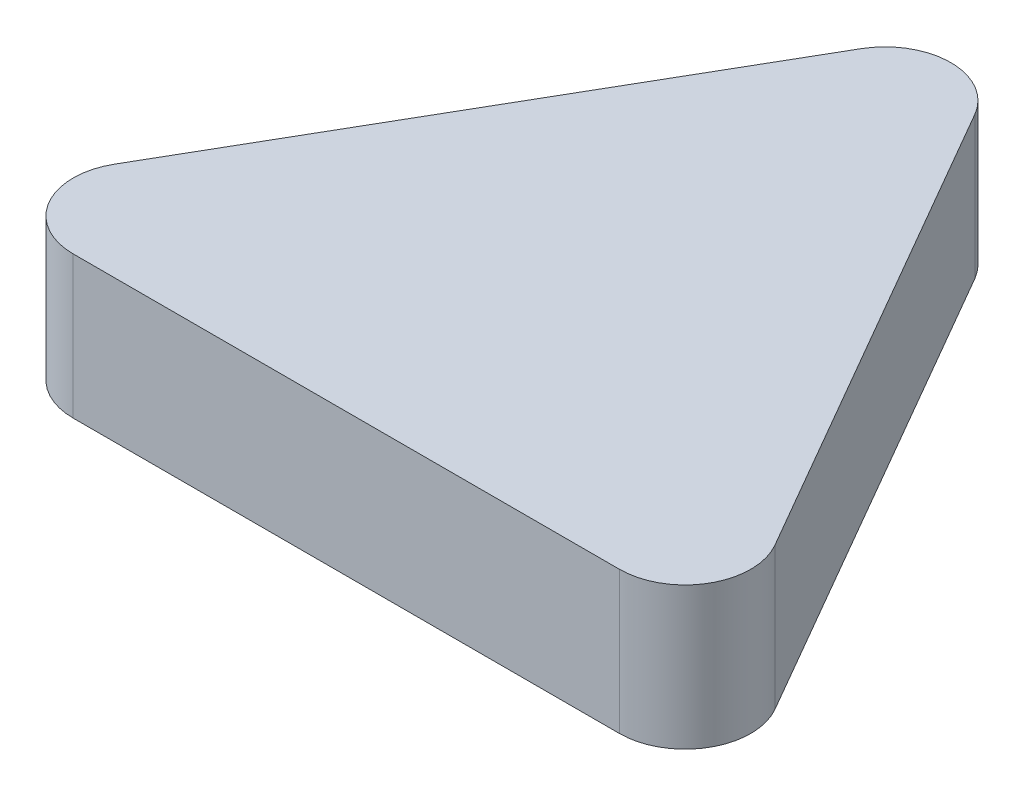
ISO-10303-21;
HEADER;
FILE_DESCRIPTION(('STEP AP214'),'2;1');
FILE_NAME('part.step','',(''),(''),'','','');
FILE_SCHEMA(('AUTOMOTIVE_DESIGN { 1 0 10303 214 1 1 1 1 }'));
ENDSEC;
DATA;
#1=APPLICATION_CONTEXT('core data for automotive mechanical design processes');
#2=APPLICATION_PROTOCOL_DEFINITION('international standard','automotive_design',2000,#1);
#3=PRODUCT_CONTEXT('',#1,'mechanical');
#4=PRODUCT('Part','Part','',(#3));
#5=PRODUCT_RELATED_PRODUCT_CATEGORY('part','',(#4));
#6=PRODUCT_DEFINITION_FORMATION('','',#4);
#7=PRODUCT_DEFINITION_CONTEXT('part definition',#1,'design');
#8=PRODUCT_DEFINITION('design','',#6,#7);
#9=PRODUCT_DEFINITION_SHAPE('','',#8);
#10=(LENGTH_UNIT() NAMED_UNIT(*) SI_UNIT(.MILLI.,.METRE.));
#11=(NAMED_UNIT(*) PLANE_ANGLE_UNIT() SI_UNIT($,.RADIAN.));
#12=(NAMED_UNIT(*) SI_UNIT($,.STERADIAN.) SOLID_ANGLE_UNIT());
#13=UNCERTAINTY_MEASURE_WITH_UNIT(LENGTH_MEASURE(1.E-05),#10,'distance_accuracy_value','');
#14=(GEOMETRIC_REPRESENTATION_CONTEXT(3) GLOBAL_UNCERTAINTY_ASSIGNED_CONTEXT((#13)) GLOBAL_UNIT_ASSIGNED_CONTEXT((#10,
#11,#12)) REPRESENTATION_CONTEXT('',''));
#15=CARTESIAN_POINT('',(0.,0.,0.));
#16=DIRECTION('',(0.,0.,1.));
#17=DIRECTION('',(1.,0.,0.));
#18=AXIS2_PLACEMENT_3D('',#15,#16,#17);
#19=CARTESIAN_POINT('',(0.,6.35,-24.0545606325167));
#20=DIRECTION('',(0.,-1.,0.));
#21=DIRECTION('',(0.,0.,-1.));
#22=AXIS2_PLACEMENT_3D('',#19,#20,#21);
#23=CYLINDRICAL_SURFACE('',#22,2.9329393674833);
#24=CARTESIAN_POINT('',(0.,0.,-24.0545606325167));
#25=DIRECTION('',(0.,1.,0.));
#26=DIRECTION('',(0.,0.,-1.));
#27=AXIS2_PLACEMENT_3D('',#24,#25,#26);
#28=CIRCLE('',#27,2.9329393674833);
#29=CARTESIAN_POINT('',(2.54,0.,-25.5210303162583));
#30=VERTEX_POINT('',#29);
#31=CARTESIAN_POINT('',(-2.54,0.,-25.5210303162584));
#32=VERTEX_POINT('',#31);
#33=EDGE_CURVE('E140',#30,#32,#28,.T.);
#34=ORIENTED_EDGE('',*,*,#33,.T.);
#35=DIRECTION('',(0.,-1.,0.));
#36=VECTOR('',#35,1.);
#37=CARTESIAN_POINT('',(-2.54,6.35,-25.5210303162584));
#38=LINE('',#37,#36);
#39=CARTESIAN_POINT('',(-2.54,6.35,-25.5210303162584));
#40=VERTEX_POINT('',#39);
#41=EDGE_CURVE('E11',#40,#32,#38,.T.);
#42=ORIENTED_EDGE('',*,*,#41,.F.);
#43=CARTESIAN_POINT('',(0.,6.35,-24.0545606325167));
#44=DIRECTION('',(0.,1.,0.));
#45=DIRECTION('',(0.,0.,-1.));
#46=AXIS2_PLACEMENT_3D('',#43,#44,#45);
#47=CIRCLE('',#46,2.9329393674833);
#48=CARTESIAN_POINT('',(2.54,6.35,-25.5210303162583));
#49=VERTEX_POINT('',#48);
#50=EDGE_CURVE('E158',#49,#40,#47,.T.);
#51=ORIENTED_EDGE('',*,*,#50,.F.);
#52=DIRECTION('',(0.,-1.,0.));
#53=VECTOR('',#52,1.);
#54=CARTESIAN_POINT('',(2.54,6.35,-25.5210303162583));
#55=LINE('',#54,#53);
#56=EDGE_CURVE('E136',#49,#30,#55,.T.);
#57=ORIENTED_EDGE('',*,*,#56,.T.);
#58=EDGE_LOOP('',(#34,#42,#51,#57));
#59=FACE_BOUND('',#58,.T.);
#60=ADVANCED_FACE('F39',(#59),#23,.T.);
#61=CARTESIAN_POINT('',(-2.54,6.35,-25.5210303162584));
#62=DIRECTION('',(0.866025403784438,0.,0.5));
#63=DIRECTION('',(0.5,0.,-0.866025403784439));
#64=AXIS2_PLACEMENT_3D('',#61,#62,#63);
#65=PLANE('',#64);
#66=DIRECTION('',(-0.5,0.,0.866025403784439));
#67=VECTOR('',#66,1.);
#68=CARTESIAN_POINT('',(-2.54,0.,-25.5210303162584));
#69=LINE('',#68,#67);
#70=CARTESIAN_POINT('',(-14.7345737230884,0.,-4.39940905122495));
#71=VERTEX_POINT('',#70);
#72=EDGE_CURVE('E144',#32,#71,#69,.T.);
#73=ORIENTED_EDGE('',*,*,#72,.T.);
#74=DIRECTION('',(0.,-1.,0.));
#75=VECTOR('',#74,1.);
#76=CARTESIAN_POINT('',(-14.7345737230884,6.35,-4.39940905122495));
#77=LINE('',#76,#75);
#78=CARTESIAN_POINT('',(-14.7345737230884,6.35,-4.39940905122495));
#79=VERTEX_POINT('',#78);
#80=EDGE_CURVE('E47',#79,#71,#77,.T.);
#81=ORIENTED_EDGE('',*,*,#80,.F.);
#82=DIRECTION('',(-0.5,0.,0.866025403784439));
#83=VECTOR('',#82,1.);
#84=CARTESIAN_POINT('',(-2.54,6.35,-25.5210303162584));
#85=LINE('',#84,#83);
#86=EDGE_CURVE('E98',#40,#79,#85,.T.);
#87=ORIENTED_EDGE('',*,*,#86,.F.);
#88=ORIENTED_EDGE('',*,*,#41,.T.);
#89=EDGE_LOOP('',(#73,#81,#87,#88));
#90=FACE_BOUND('',#89,.T.);
#91=ADVANCED_FACE('F305',(#90),#65,.F.);
#92=CARTESIAN_POINT('',(-12.1945737230884,6.35,-2.9329393674833));
#93=DIRECTION('',(0.,-1.,0.));
#94=DIRECTION('',(0.,0.,-1.));
#95=AXIS2_PLACEMENT_3D('',#92,#93,#94);
#96=CYLINDRICAL_SURFACE('',#95,2.9329393674833);
#97=CARTESIAN_POINT('',(-12.1945737230884,0.,-2.9329393674833));
#98=DIRECTION('',(0.,1.,0.));
#99=DIRECTION('',(0.,0.,-1.));
#100=AXIS2_PLACEMENT_3D('',#97,#98,#99);
#101=CIRCLE('',#100,2.9329393674833);
#102=CARTESIAN_POINT('',(-12.1945737230884,0.,0.));
#103=VERTEX_POINT('',#102);
#104=EDGE_CURVE('E148',#71,#103,#101,.T.);
#105=ORIENTED_EDGE('',*,*,#104,.T.);
#106=DIRECTION('',(0.,-1.,0.));
#107=VECTOR('',#106,1.);
#108=CARTESIAN_POINT('',(-12.1945737230884,6.35,0.));
#109=LINE('',#108,#107);
#110=CARTESIAN_POINT('',(-12.1945737230884,6.35,0.));
#111=VERTEX_POINT('',#110);
#112=EDGE_CURVE('E129',#111,#103,#109,.T.);
#113=ORIENTED_EDGE('',*,*,#112,.F.);
#114=CARTESIAN_POINT('',(-12.1945737230884,6.35,-2.9329393674833));
#115=DIRECTION('',(0.,1.,0.));
#116=DIRECTION('',(0.,0.,-1.));
#117=AXIS2_PLACEMENT_3D('',#114,#115,#116);
#118=CIRCLE('',#117,2.9329393674833);
#119=EDGE_CURVE('E115',#79,#111,#118,.T.);
#120=ORIENTED_EDGE('',*,*,#119,.F.);
#121=ORIENTED_EDGE('',*,*,#80,.T.);
#122=EDGE_LOOP('',(#105,#113,#120,#121));
#123=FACE_BOUND('',#122,.T.);
#124=ADVANCED_FACE('F168',(#123),#96,.T.);
#125=CARTESIAN_POINT('',(12.1945737230884,6.35,0.));
#126=DIRECTION('',(0.,0.,-1.));
#127=DIRECTION('',(-1.,0.,0.));
#128=AXIS2_PLACEMENT_3D('',#125,#126,#127);
#129=PLANE('',#128);
#130=DIRECTION('',(1.,0.,0.));
#131=VECTOR('',#130,1.);
#132=CARTESIAN_POINT('',(12.1945737230884,0.,0.));
#133=LINE('',#132,#131);
#134=CARTESIAN_POINT('',(12.1945737230884,0.,0.));
#135=VERTEX_POINT('',#134);
#136=EDGE_CURVE('E125',#103,#135,#133,.T.);
#137=ORIENTED_EDGE('',*,*,#136,.T.);
#138=DIRECTION('',(0.,-1.,0.));
#139=VECTOR('',#138,1.);
#140=CARTESIAN_POINT('',(12.1945737230884,6.35,0.));
#141=LINE('',#140,#139);
#142=CARTESIAN_POINT('',(12.1945737230884,6.35,0.));
#143=VERTEX_POINT('',#142);
#144=EDGE_CURVE('E122',#143,#135,#141,.T.);
#145=ORIENTED_EDGE('',*,*,#144,.F.);
#146=DIRECTION('',(1.,0.,0.));
#147=VECTOR('',#146,1.);
#148=CARTESIAN_POINT('',(12.1945737230884,6.35,0.));
#149=LINE('',#148,#147);
#150=EDGE_CURVE('E108',#111,#143,#149,.T.);
#151=ORIENTED_EDGE('',*,*,#150,.F.);
#152=ORIENTED_EDGE('',*,*,#112,.T.);
#153=EDGE_LOOP('',(#137,#145,#151,#152));
#154=FACE_BOUND('',#153,.T.);
#155=ADVANCED_FACE('F123',(#154),#129,.F.);
#156=CARTESIAN_POINT('',(12.1945737230884,6.35,-2.9329393674833));
#157=DIRECTION('',(0.,-1.,0.));
#158=DIRECTION('',(0.,0.,-1.));
#159=AXIS2_PLACEMENT_3D('',#156,#157,#158);
#160=CYLINDRICAL_SURFACE('',#159,2.9329393674833);
#161=CARTESIAN_POINT('',(12.1945737230884,0.,-2.9329393674833));
#162=DIRECTION('',(0.,1.,0.));
#163=DIRECTION('',(0.,0.,-1.));
#164=AXIS2_PLACEMENT_3D('',#161,#162,#163);
#165=CIRCLE('',#164,2.9329393674833);
#166=CARTESIAN_POINT('',(14.7345737230883,0.,-4.39940905122495));
#167=VERTEX_POINT('',#166);
#168=EDGE_CURVE('E153',#135,#167,#165,.T.);
#169=ORIENTED_EDGE('',*,*,#168,.T.);
#170=DIRECTION('',(0.,-1.,0.));
#171=VECTOR('',#170,1.);
#172=CARTESIAN_POINT('',(14.7345737230883,6.35,-4.39940905122495));
#173=LINE('',#172,#171);
#174=CARTESIAN_POINT('',(14.7345737230883,6.35,-4.39940905122495));
#175=VERTEX_POINT('',#174);
#176=EDGE_CURVE('E130',#175,#167,#173,.T.);
#177=ORIENTED_EDGE('',*,*,#176,.F.);
#178=CARTESIAN_POINT('',(12.1945737230884,6.35,-2.9329393674833));
#179=DIRECTION('',(0.,1.,0.));
#180=DIRECTION('',(0.,0.,-1.));
#181=AXIS2_PLACEMENT_3D('',#178,#179,#180);
#182=CIRCLE('',#181,2.9329393674833);
#183=EDGE_CURVE('E112',#143,#175,#182,.T.);
#184=ORIENTED_EDGE('',*,*,#183,.F.);
#185=ORIENTED_EDGE('',*,*,#144,.T.);
#186=EDGE_LOOP('',(#169,#177,#184,#185));
#187=FACE_BOUND('',#186,.T.);
#188=ADVANCED_FACE('F132',(#187),#160,.T.);
#189=CARTESIAN_POINT('',(2.54,6.35,-25.5210303162583));
#190=DIRECTION('',(-0.866025403784439,0.,0.5));
#191=DIRECTION('',(0.5,0.,0.866025403784439));
#192=AXIS2_PLACEMENT_3D('',#189,#190,#191);
#193=PLANE('',#192);
#194=DIRECTION('',(-0.5,0.,-0.866025403784439));
#195=VECTOR('',#194,1.);
#196=CARTESIAN_POINT('',(2.54,0.,-25.5210303162583));
#197=LINE('',#196,#195);
#198=EDGE_CURVE('E90',#167,#30,#197,.T.);
#199=ORIENTED_EDGE('',*,*,#198,.T.);
#200=ORIENTED_EDGE('',*,*,#56,.F.);
#201=DIRECTION('',(-0.5,0.,-0.866025403784439));
#202=VECTOR('',#201,1.);
#203=CARTESIAN_POINT('',(2.54,6.35,-25.5210303162583));
#204=LINE('',#203,#202);
#205=EDGE_CURVE('E63',#175,#49,#204,.T.);
#206=ORIENTED_EDGE('',*,*,#205,.F.);
#207=ORIENTED_EDGE('',*,*,#176,.T.);
#208=EDGE_LOOP('',(#199,#200,#206,#207));
#209=FACE_BOUND('',#208,.T.);
#210=ADVANCED_FACE('F172',(#209),#193,.F.);
#211=CARTESIAN_POINT('',(0.,6.35,-24.0545606325167));
#212=DIRECTION('',(0.,-1.,0.));
#213=DIRECTION('',(0.,0.,-1.));
#214=AXIS2_PLACEMENT_3D('',#211,#212,#213);
#215=PLANE('',#214);
#216=ORIENTED_EDGE('',*,*,#50,.T.);
#217=ORIENTED_EDGE('',*,*,#86,.T.);
#218=ORIENTED_EDGE('',*,*,#119,.T.);
#219=ORIENTED_EDGE('',*,*,#150,.T.);
#220=ORIENTED_EDGE('',*,*,#183,.T.);
#221=ORIENTED_EDGE('',*,*,#205,.T.);
#222=EDGE_LOOP('',(#216,#217,#218,#219,#220,#221));
#223=FACE_BOUND('',#222,.T.);
#224=ADVANCED_FACE('F110',(#223),#215,.F.);
#225=CARTESIAN_POINT('',(0.,0.,-24.0545606325167));
#226=DIRECTION('',(0.,-1.,0.));
#227=DIRECTION('',(0.,0.,-1.));
#228=AXIS2_PLACEMENT_3D('',#225,#226,#227);
#229=PLANE('',#228);
#230=CARTESIAN_POINT('',(-12.1945737230884,0.,-2.9329393674833));
#231=DIRECTION('',(0.,-1.,0.));
#232=DIRECTION('',(0.,0.,-1.));
#233=AXIS2_PLACEMENT_3D('',#230,#231,#232);
#234=CIRCLE('',#233,1.5994393674833);
#235=CARTESIAN_POINT('',(-12.1945737230884,0.,-1.3335));
#236=VERTEX_POINT('',#235);
#237=CARTESIAN_POINT('',(-13.5797288471418,0.,-3.73265905122494));
#238=VERTEX_POINT('',#237);
#239=EDGE_CURVE('E54',#236,#238,#234,.T.);
#240=ORIENTED_EDGE('',*,*,#239,.F.);
#241=DIRECTION('',(-1.,0.,0.));
#242=VECTOR('',#241,1.);
#243=CARTESIAN_POINT('',(12.1945737230884,0.,-1.3335));
#244=LINE('',#243,#242);
#245=CARTESIAN_POINT('',(12.1945737230884,0.,-1.3335));
#246=VERTEX_POINT('',#245);
#247=EDGE_CURVE('E204',#246,#236,#244,.T.);
#248=ORIENTED_EDGE('',*,*,#247,.F.);
#249=CARTESIAN_POINT('',(12.1945737230884,0.,-2.9329393674833));
#250=DIRECTION('',(0.,-1.,0.));
#251=DIRECTION('',(0.,0.,-1.));
#252=AXIS2_PLACEMENT_3D('',#249,#250,#251);
#253=CIRCLE('',#252,1.5994393674833);
#254=CARTESIAN_POINT('',(13.5797288471418,0.,-3.73265905122495));
#255=VERTEX_POINT('',#254);
#256=EDGE_CURVE('E209',#255,#246,#253,.T.);
#257=ORIENTED_EDGE('',*,*,#256,.F.);
#258=DIRECTION('',(0.5,0.,0.866025403784439));
#259=VECTOR('',#258,1.);
#260=CARTESIAN_POINT('',(1.38515512405345,0.,-24.8542803162584));
#261=LINE('',#260,#259);
#262=CARTESIAN_POINT('',(1.38515512405345,0.,-24.8542803162584));
#263=VERTEX_POINT('',#262);
#264=EDGE_CURVE('E213',#263,#255,#261,.T.);
#265=ORIENTED_EDGE('',*,*,#264,.F.);
#266=CARTESIAN_POINT('',(0.,0.,-24.0545606325167));
#267=DIRECTION('',(0.,-1.,0.));
#268=DIRECTION('',(0.,0.,-1.));
#269=AXIS2_PLACEMENT_3D('',#266,#267,#268);
#270=CIRCLE('',#269,1.5994393674833);
#271=CARTESIAN_POINT('',(-1.38515512405345,0.,-24.8542803162584));
#272=VERTEX_POINT('',#271);
#273=EDGE_CURVE('E217',#272,#263,#270,.T.);
#274=ORIENTED_EDGE('',*,*,#273,.F.);
#275=DIRECTION('',(0.5,0.,-0.866025403784438));
#276=VECTOR('',#275,1.);
#277=CARTESIAN_POINT('',(-13.5797288471418,0.,-3.73265905122495));
#278=LINE('',#277,#276);
#279=EDGE_CURVE('E221',#238,#272,#278,.T.);
#280=ORIENTED_EDGE('',*,*,#279,.F.);
#281=EDGE_LOOP('',(#240,#248,#257,#265,#274,#280));
#282=FACE_BOUND('',#281,.T.);
#283=ORIENTED_EDGE('',*,*,#33,.F.);
#284=ORIENTED_EDGE('',*,*,#198,.F.);
#285=ORIENTED_EDGE('',*,*,#168,.F.);
#286=ORIENTED_EDGE('',*,*,#136,.F.);
#287=ORIENTED_EDGE('',*,*,#104,.F.);
#288=ORIENTED_EDGE('',*,*,#72,.F.);
#289=EDGE_LOOP('',(#283,#284,#285,#286,#287,#288));
#290=FACE_BOUND('',#289,.T.);
#291=ADVANCED_FACE('F171',(#282,#290),#229,.T.);
#292=CARTESIAN_POINT('',(-12.1945737230884,2.413,-2.9329393674833));
#293=DIRECTION('',(0.,-1.,0.));
#294=DIRECTION('',(0.,0.,-1.));
#295=AXIS2_PLACEMENT_3D('',#292,#293,#294);
#296=CYLINDRICAL_SURFACE('',#295,1.5994393674833);
#297=ORIENTED_EDGE('',*,*,#239,.T.);
#298=DIRECTION('',(0.,-1.,0.));
#299=VECTOR('',#298,1.);
#300=CARTESIAN_POINT('',(-13.5797288471418,2.413,-3.73265905122495));
#301=LINE('',#300,#299);
#302=CARTESIAN_POINT('',(-13.5797288471418,2.413,-3.73265905122495));
#303=VERTEX_POINT('',#302);
#304=EDGE_CURVE('E181',#303,#238,#301,.T.);
#305=ORIENTED_EDGE('',*,*,#304,.F.);
#306=CARTESIAN_POINT('',(-12.1945737230884,2.413,-2.9329393674833));
#307=DIRECTION('',(0.,-1.,0.));
#308=DIRECTION('',(0.,0.,-1.));
#309=AXIS2_PLACEMENT_3D('',#306,#307,#308);
#310=CIRCLE('',#309,1.5994393674833);
#311=CARTESIAN_POINT('',(-12.1945737230884,2.413,-1.3335));
#312=VERTEX_POINT('',#311);
#313=EDGE_CURVE('E208',#312,#303,#310,.T.);
#314=ORIENTED_EDGE('',*,*,#313,.F.);
#315=DIRECTION('',(0.,-1.,0.));
#316=VECTOR('',#315,1.);
#317=CARTESIAN_POINT('',(-12.1945737230884,2.413,-1.3335));
#318=LINE('',#317,#316);
#319=EDGE_CURVE('E145',#312,#236,#318,.T.);
#320=ORIENTED_EDGE('',*,*,#319,.T.);
#321=EDGE_LOOP('',(#297,#305,#314,#320));
#322=FACE_BOUND('',#321,.T.);
#323=ADVANCED_FACE('F256',(#322),#296,.F.);
#324=CARTESIAN_POINT('',(12.1945737230884,2.413,-1.3335));
#325=DIRECTION('',(0.,0.,1.));
#326=DIRECTION('',(1.,0.,0.));
#327=AXIS2_PLACEMENT_3D('',#324,#325,#326);
#328=PLANE('',#327);
#329=ORIENTED_EDGE('',*,*,#247,.T.);
#330=ORIENTED_EDGE('',*,*,#319,.F.);
#331=DIRECTION('',(-1.,0.,0.));
#332=VECTOR('',#331,1.);
#333=CARTESIAN_POINT('',(12.1945737230884,2.413,-1.3335));
#334=LINE('',#333,#332);
#335=CARTESIAN_POINT('',(12.1945737230884,2.413,-1.3335));
#336=VERTEX_POINT('',#335);
#337=EDGE_CURVE('E186',#336,#312,#334,.T.);
#338=ORIENTED_EDGE('',*,*,#337,.F.);
#339=DIRECTION('',(0.,-1.,0.));
#340=VECTOR('',#339,1.);
#341=CARTESIAN_POINT('',(12.1945737230884,2.413,-1.3335));
#342=LINE('',#341,#340);
#343=EDGE_CURVE('E198',#336,#246,#342,.T.);
#344=ORIENTED_EDGE('',*,*,#343,.T.);
#345=EDGE_LOOP('',(#329,#330,#338,#344));
#346=FACE_BOUND('',#345,.T.);
#347=ADVANCED_FACE('F272',(#346),#328,.F.);
#348=CARTESIAN_POINT('',(12.1945737230884,2.413,-2.9329393674833));
#349=DIRECTION('',(0.,-1.,0.));
#350=DIRECTION('',(0.,0.,-1.));
#351=AXIS2_PLACEMENT_3D('',#348,#349,#350);
#352=CYLINDRICAL_SURFACE('',#351,1.5994393674833);
#353=ORIENTED_EDGE('',*,*,#256,.T.);
#354=ORIENTED_EDGE('',*,*,#343,.F.);
#355=CARTESIAN_POINT('',(12.1945737230884,2.413,-2.9329393674833));
#356=DIRECTION('',(0.,-1.,0.));
#357=DIRECTION('',(0.,0.,-1.));
#358=AXIS2_PLACEMENT_3D('',#355,#356,#357);
#359=CIRCLE('',#358,1.5994393674833);
#360=CARTESIAN_POINT('',(13.5797288471418,2.413,-3.73265905122495));
#361=VERTEX_POINT('',#360);
#362=EDGE_CURVE('E230',#361,#336,#359,.T.);
#363=ORIENTED_EDGE('',*,*,#362,.F.);
#364=DIRECTION('',(0.,-1.,0.));
#365=VECTOR('',#364,1.);
#366=CARTESIAN_POINT('',(13.5797288471418,2.413,-3.73265905122495));
#367=LINE('',#366,#365);
#368=EDGE_CURVE('E194',#361,#255,#367,.T.);
#369=ORIENTED_EDGE('',*,*,#368,.T.);
#370=EDGE_LOOP('',(#353,#354,#363,#369));
#371=FACE_BOUND('',#370,.T.);
#372=ADVANCED_FACE('F277',(#371),#352,.F.);
#373=CARTESIAN_POINT('',(1.38515512405345,2.413,-24.8542803162584));
#374=DIRECTION('',(0.866025403784439,0.,-0.5));
#375=DIRECTION('',(-0.5,0.,-0.866025403784439));
#376=AXIS2_PLACEMENT_3D('',#373,#374,#375);
#377=PLANE('',#376);
#378=ORIENTED_EDGE('',*,*,#264,.T.);
#379=ORIENTED_EDGE('',*,*,#368,.F.);
#380=DIRECTION('',(0.5,0.,0.866025403784439));
#381=VECTOR('',#380,1.);
#382=CARTESIAN_POINT('',(1.38515512405345,2.413,-24.8542803162584));
#383=LINE('',#382,#381);
#384=CARTESIAN_POINT('',(1.38515512405345,2.413,-24.8542803162584));
#385=VERTEX_POINT('',#384);
#386=EDGE_CURVE('E234',#385,#361,#383,.T.);
#387=ORIENTED_EDGE('',*,*,#386,.F.);
#388=DIRECTION('',(0.,-1.,0.));
#389=VECTOR('',#388,1.);
#390=CARTESIAN_POINT('',(1.38515512405345,2.413,-24.8542803162584));
#391=LINE('',#390,#389);
#392=EDGE_CURVE('E190',#385,#263,#391,.T.);
#393=ORIENTED_EDGE('',*,*,#392,.T.);
#394=EDGE_LOOP('',(#378,#379,#387,#393));
#395=FACE_BOUND('',#394,.T.);
#396=ADVANCED_FACE('F295',(#395),#377,.F.);
#397=CARTESIAN_POINT('',(0.,2.413,-24.0545606325167));
#398=DIRECTION('',(0.,-1.,0.));
#399=DIRECTION('',(0.,0.,-1.));
#400=AXIS2_PLACEMENT_3D('',#397,#398,#399);
#401=CYLINDRICAL_SURFACE('',#400,1.5994393674833);
#402=ORIENTED_EDGE('',*,*,#273,.T.);
#403=ORIENTED_EDGE('',*,*,#392,.F.);
#404=CARTESIAN_POINT('',(0.,2.413,-24.0545606325167));
#405=DIRECTION('',(0.,-1.,0.));
#406=DIRECTION('',(0.,0.,-1.));
#407=AXIS2_PLACEMENT_3D('',#404,#405,#406);
#408=CIRCLE('',#407,1.5994393674833);
#409=CARTESIAN_POINT('',(-1.38515512405345,2.413,-24.8542803162584));
#410=VERTEX_POINT('',#409);
#411=EDGE_CURVE('E238',#410,#385,#408,.T.);
#412=ORIENTED_EDGE('',*,*,#411,.F.);
#413=DIRECTION('',(0.,-1.,0.));
#414=VECTOR('',#413,1.);
#415=CARTESIAN_POINT('',(-1.38515512405345,2.413,-24.8542803162584));
#416=LINE('',#415,#414);
#417=EDGE_CURVE('E185',#410,#272,#416,.T.);
#418=ORIENTED_EDGE('',*,*,#417,.T.);
#419=EDGE_LOOP('',(#402,#403,#412,#418));
#420=FACE_BOUND('',#419,.T.);
#421=ADVANCED_FACE('F291',(#420),#401,.F.);
#422=CARTESIAN_POINT('',(-13.5797288471418,2.413,-3.73265905122495));
#423=DIRECTION('',(-0.866025403784438,0.,-0.5));
#424=DIRECTION('',(-0.5,0.,0.866025403784438));
#425=AXIS2_PLACEMENT_3D('',#422,#423,#424);
#426=PLANE('',#425);
#427=ORIENTED_EDGE('',*,*,#279,.T.);
#428=ORIENTED_EDGE('',*,*,#417,.F.);
#429=DIRECTION('',(0.5,0.,-0.866025403784438));
#430=VECTOR('',#429,1.);
#431=CARTESIAN_POINT('',(-13.5797288471418,2.413,-3.73265905122495));
#432=LINE('',#431,#430);
#433=EDGE_CURVE('E242',#303,#410,#432,.T.);
#434=ORIENTED_EDGE('',*,*,#433,.F.);
#435=ORIENTED_EDGE('',*,*,#304,.T.);
#436=EDGE_LOOP('',(#427,#428,#434,#435));
#437=FACE_BOUND('',#436,.T.);
#438=ADVANCED_FACE('F285',(#437),#426,.F.);
#439=CARTESIAN_POINT('',(-12.1945737230884,2.413,-2.9329393674833));
#440=DIRECTION('',(0.,-1.,0.));
#441=DIRECTION('',(0.,0.,-1.));
#442=AXIS2_PLACEMENT_3D('',#439,#440,#441);
#443=PLANE('',#442);
#444=ORIENTED_EDGE('',*,*,#313,.T.);
#445=ORIENTED_EDGE('',*,*,#433,.T.);
#446=ORIENTED_EDGE('',*,*,#411,.T.);
#447=ORIENTED_EDGE('',*,*,#386,.T.);
#448=ORIENTED_EDGE('',*,*,#362,.T.);
#449=ORIENTED_EDGE('',*,*,#337,.T.);
#450=EDGE_LOOP('',(#444,#445,#446,#447,#448,#449));
#451=FACE_BOUND('',#450,.T.);
#452=ADVANCED_FACE('F251',(#451),#443,.T.);
#453=CLOSED_SHELL('',(#60,#91,#124,#155,#188,#210,#224,#291,#323,#347,#372,#396,#421,#438,#452));
#454=MANIFOLD_SOLID_BREP('B2',#453);
#455=ADVANCED_BREP_SHAPE_REPRESENTATION('',(#18,#454),#14);
#456=SHAPE_DEFINITION_REPRESENTATION(#9,#455);
ENDSEC;
END-ISO-10303-21;
